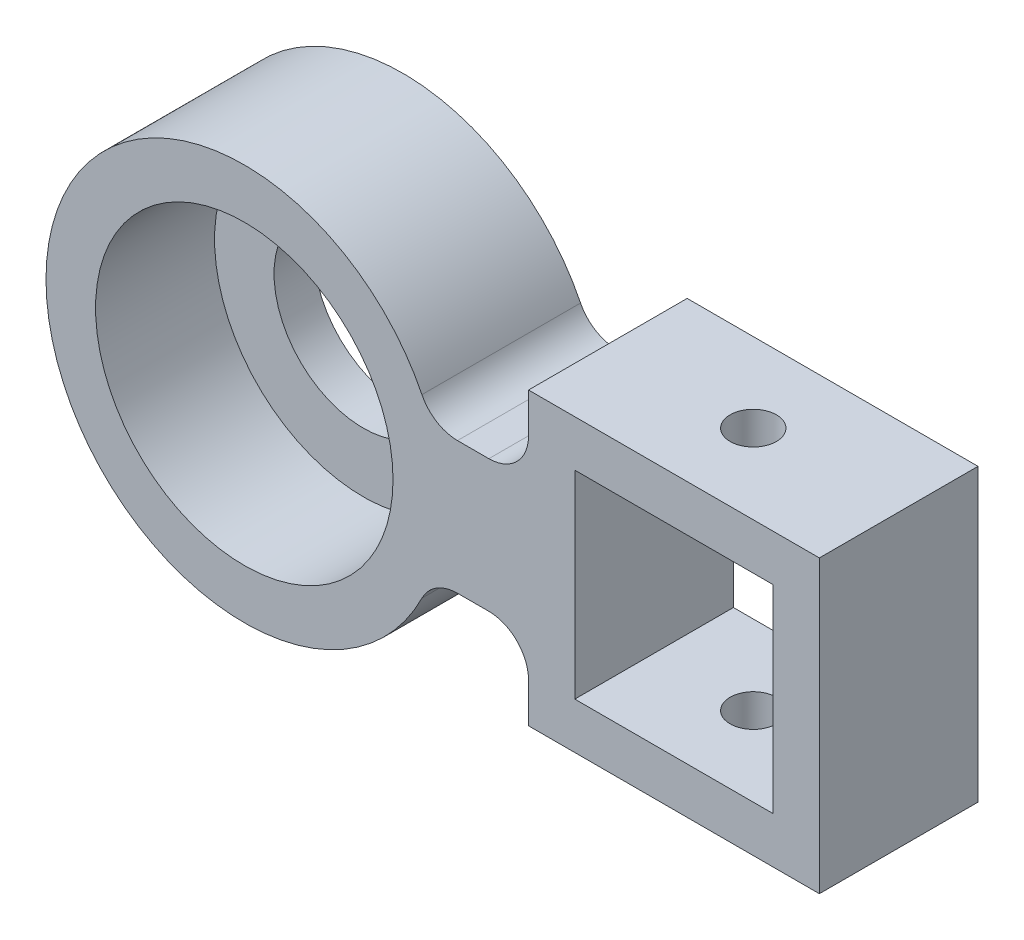
ISO-10303-21;
HEADER;
FILE_DESCRIPTION(('STEP AP214'),'2;1');
FILE_NAME('part.step','',(''),(''),'','','');
FILE_SCHEMA(('AUTOMOTIVE_DESIGN { 1 0 10303 214 1 1 1 1 }'));
ENDSEC;
DATA;
#1=APPLICATION_CONTEXT('core data for automotive mechanical design processes');
#2=APPLICATION_PROTOCOL_DEFINITION('international standard','automotive_design',2000,#1);
#3=PRODUCT_CONTEXT('',#1,'mechanical');
#4=PRODUCT('Part','Part','',(#3));
#5=PRODUCT_RELATED_PRODUCT_CATEGORY('part','',(#4));
#6=PRODUCT_DEFINITION_FORMATION('','',#4);
#7=PRODUCT_DEFINITION_CONTEXT('part definition',#1,'design');
#8=PRODUCT_DEFINITION('design','',#6,#7);
#9=PRODUCT_DEFINITION_SHAPE('','',#8);
#10=(LENGTH_UNIT() NAMED_UNIT(*) SI_UNIT(.MILLI.,.METRE.));
#11=(NAMED_UNIT(*) PLANE_ANGLE_UNIT() SI_UNIT($,.RADIAN.));
#12=(NAMED_UNIT(*) SI_UNIT($,.STERADIAN.) SOLID_ANGLE_UNIT());
#13=UNCERTAINTY_MEASURE_WITH_UNIT(LENGTH_MEASURE(1.E-05),#10,'distance_accuracy_value','');
#14=(GEOMETRIC_REPRESENTATION_CONTEXT(3) GLOBAL_UNCERTAINTY_ASSIGNED_CONTEXT((#13)) GLOBAL_UNIT_ASSIGNED_CONTEXT((#10,
#11,#12)) REPRESENTATION_CONTEXT('',''));
#15=CARTESIAN_POINT('',(0.,0.,0.));
#16=DIRECTION('',(0.,0.,1.));
#17=DIRECTION('',(1.,0.,0.));
#18=AXIS2_PLACEMENT_3D('',#15,#16,#17);
#19=CARTESIAN_POINT('',(-40.368931918618,3.90275593961977,12.));
#20=DIRECTION('',(0.,0.,-1.));
#21=DIRECTION('',(-1.,0.,0.));
#22=AXIS2_PLACEMENT_3D('',#19,#20,#21);
#23=CYLINDRICAL_SURFACE('',#22,6.75);
#24=CARTESIAN_POINT('',(-40.368931918618,3.90275593961977,0.));
#25=DIRECTION('',(0.,0.,1.));
#26=DIRECTION('',(1.,0.,0.));
#27=AXIS2_PLACEMENT_3D('',#24,#25,#26);
#28=CIRCLE('',#27,6.75);
#29=CARTESIAN_POINT('',(-33.618931918618,3.90275593961977,0.));
#30=VERTEX_POINT('',#29);
#31=EDGE_CURVE('E184',#30,#30,#28,.T.);
#32=ORIENTED_EDGE('',*,*,#31,.F.);
#33=EDGE_LOOP('',(#32));
#34=FACE_BOUND('',#33,.T.);
#35=CARTESIAN_POINT('',(-40.368931918618,3.90275593961977,3.));
#36=DIRECTION('',(0.,0.,1.));
#37=DIRECTION('',(1.,0.,0.));
#38=AXIS2_PLACEMENT_3D('',#35,#36,#37);
#39=CIRCLE('',#38,6.75);
#40=CARTESIAN_POINT('',(-33.618931918618,3.90275593961977,3.));
#41=VERTEX_POINT('',#40);
#42=EDGE_CURVE('E39',#41,#41,#39,.T.);
#43=ORIENTED_EDGE('',*,*,#42,.T.);
#44=EDGE_LOOP('',(#43));
#45=FACE_BOUND('',#44,.T.);
#46=ADVANCED_FACE('F35',(#34,#45),#23,.F.);
#47=CARTESIAN_POINT('',(-40.368931918618,3.90275593961977,12.));
#48=DIRECTION('',(0.,0.,1.));
#49=DIRECTION('',(1.,0.,0.));
#50=AXIS2_PLACEMENT_3D('',#47,#48,#49);
#51=PLANE('',#50);
#52=CARTESIAN_POINT('',(-40.368931918618,3.90275593961977,12.));
#53=DIRECTION('',(0.,0.,1.));
#54=DIRECTION('',(1.,0.,0.));
#55=AXIS2_PLACEMENT_3D('',#52,#53,#54);
#56=CIRCLE('',#55,11.25);
#57=CARTESIAN_POINT('',(-29.118931918618,3.90275593961977,12.));
#58=VERTEX_POINT('',#57);
#59=EDGE_CURVE('E413',#58,#58,#56,.T.);
#60=ORIENTED_EDGE('',*,*,#59,.F.);
#61=EDGE_LOOP('',(#60));
#62=FACE_BOUND('',#61,.T.);
#63=DIRECTION('',(1.,0.,0.));
#64=VECTOR('',#63,1.);
#65=CARTESIAN_POINT('',(-15.368931918618,-3.59724406038023,12.));
#66=LINE('',#65,#64);
#67=CARTESIAN_POINT('',(-15.368931918618,-3.59724406038023,12.));
#68=VERTEX_POINT('',#67);
#69=CARTESIAN_POINT('',(-0.368931918617967,-3.59724406038023,12.));
#70=VERTEX_POINT('',#69);
#71=EDGE_CURVE('E161',#68,#70,#66,.T.);
#72=ORIENTED_EDGE('',*,*,#71,.F.);
#73=DIRECTION('',(0.,-1.,0.));
#74=VECTOR('',#73,1.);
#75=CARTESIAN_POINT('',(-15.368931918618,11.4027559396198,12.));
#76=LINE('',#75,#74);
#77=CARTESIAN_POINT('',(-15.368931918618,11.4027559396198,12.));
#78=VERTEX_POINT('',#77);
#79=EDGE_CURVE('E151',#78,#68,#76,.T.);
#80=ORIENTED_EDGE('',*,*,#79,.F.);
#81=DIRECTION('',(-1.,0.,0.));
#82=VECTOR('',#81,1.);
#83=CARTESIAN_POINT('',(-15.368931918618,11.4027559396198,12.));
#84=LINE('',#83,#82);
#85=CARTESIAN_POINT('',(-0.368931918617969,11.4027559396198,12.));
#86=VERTEX_POINT('',#85);
#87=EDGE_CURVE('E177',#86,#78,#84,.T.);
#88=ORIENTED_EDGE('',*,*,#87,.F.);
#89=DIRECTION('',(0.,1.,0.));
#90=VECTOR('',#89,1.);
#91=CARTESIAN_POINT('',(-0.368931918617969,11.4027559396198,12.));
#92=LINE('',#91,#90);
#93=EDGE_CURVE('E175',#70,#86,#92,.T.);
#94=ORIENTED_EDGE('',*,*,#93,.F.);
#95=EDGE_LOOP('',(#72,#80,#88,#94));
#96=FACE_BOUND('',#95,.T.);
#97=DIRECTION('',(0.,-1.,0.));
#98=VECTOR('',#97,1.);
#99=CARTESIAN_POINT('',(-18.868931918618,14.9027559396198,12.));
#100=LINE('',#99,#98);
#101=CARTESIAN_POINT('',(-18.868931918618,14.9027559396198,12.));
#102=VERTEX_POINT('',#101);
#103=CARTESIAN_POINT('',(-18.868931918618,11.9027559396198,12.));
#104=VERTEX_POINT('',#103);
#105=EDGE_CURVE('E195',#102,#104,#100,.T.);
#106=ORIENTED_EDGE('',*,*,#105,.T.);
#107=CARTESIAN_POINT('',(-21.868931918618,11.9027559396198,12.));
#108=DIRECTION('',(0.,0.,1.));
#109=DIRECTION('',(1.,0.,0.));
#110=AXIS2_PLACEMENT_3D('',#107,#108,#109);
#111=CIRCLE('',#110,3.);
#112=CARTESIAN_POINT('',(-21.868931918618,8.90275593961977,12.));
#113=VERTEX_POINT('',#112);
#114=EDGE_CURVE('E273',#104,#113,#111,.F.);
#115=ORIENTED_EDGE('',*,*,#114,.T.);
#116=DIRECTION('',(-1.,0.,0.));
#117=VECTOR('',#116,1.);
#118=CARTESIAN_POINT('',(-26.226796294887,8.90275593961977,12.));
#119=LINE('',#118,#117);
#120=CARTESIAN_POINT('',(-24.2444164220209,8.90275593961977,12.));
#121=VERTEX_POINT('',#120);
#122=EDGE_CURVE('E198',#113,#121,#119,.T.);
#123=ORIENTED_EDGE('',*,*,#122,.T.);
#124=CARTESIAN_POINT('',(-24.2444164220209,11.9027559396198,12.));
#125=DIRECTION('',(0.,0.,1.));
#126=DIRECTION('',(1.,0.,0.));
#127=AXIS2_PLACEMENT_3D('',#124,#125,#126);
#128=CIRCLE('',#127,3.);
#129=CARTESIAN_POINT('',(-26.9318356714537,10.5694226062864,12.));
#130=VERTEX_POINT('',#129);
#131=EDGE_CURVE('E58',#121,#130,#128,.F.);
#132=ORIENTED_EDGE('',*,*,#131,.T.);
#133=CARTESIAN_POINT('',(-40.368931918618,3.90275593961977,12.));
#134=DIRECTION('',(0.,0.,1.));
#135=DIRECTION('',(1.,0.,0.));
#136=AXIS2_PLACEMENT_3D('',#133,#134,#135);
#137=CIRCLE('',#136,15.);
#138=CARTESIAN_POINT('',(-26.9318356714537,-2.7639107270469,12.));
#139=VERTEX_POINT('',#138);
#140=EDGE_CURVE('E201',#130,#139,#137,.T.);
#141=ORIENTED_EDGE('',*,*,#140,.T.);
#142=CARTESIAN_POINT('',(-24.2444164220209,-4.09724406038023,12.));
#143=DIRECTION('',(0.,0.,1.));
#144=DIRECTION('',(1.,0.,0.));
#145=AXIS2_PLACEMENT_3D('',#142,#143,#144);
#146=CIRCLE('',#145,3.);
#147=CARTESIAN_POINT('',(-24.2444164220209,-1.09724406038023,12.));
#148=VERTEX_POINT('',#147);
#149=EDGE_CURVE('E12',#139,#148,#146,.F.);
#150=ORIENTED_EDGE('',*,*,#149,.T.);
#151=DIRECTION('',(1.,0.,0.));
#152=VECTOR('',#151,1.);
#153=CARTESIAN_POINT('',(-26.226796294887,-1.09724406038023,12.));
#154=LINE('',#153,#152);
#155=CARTESIAN_POINT('',(-21.868931918618,-1.09724406038023,12.));
#156=VERTEX_POINT('',#155);
#157=EDGE_CURVE('E203',#148,#156,#154,.T.);
#158=ORIENTED_EDGE('',*,*,#157,.T.);
#159=CARTESIAN_POINT('',(-21.868931918618,-4.09724406038023,12.));
#160=DIRECTION('',(0.,0.,1.));
#161=DIRECTION('',(1.,0.,0.));
#162=AXIS2_PLACEMENT_3D('',#159,#160,#161);
#163=CIRCLE('',#162,3.);
#164=CARTESIAN_POINT('',(-18.868931918618,-4.09724406038023,12.));
#165=VERTEX_POINT('',#164);
#166=EDGE_CURVE('E269',#156,#165,#163,.F.);
#167=ORIENTED_EDGE('',*,*,#166,.T.);
#168=DIRECTION('',(0.,-1.,0.));
#169=VECTOR('',#168,1.);
#170=CARTESIAN_POINT('',(-18.868931918618,-1.09724406038023,12.));
#171=LINE('',#170,#169);
#172=CARTESIAN_POINT('',(-18.868931918618,-7.09724406038023,12.));
#173=VERTEX_POINT('',#172);
#174=EDGE_CURVE('E206',#165,#173,#171,.T.);
#175=ORIENTED_EDGE('',*,*,#174,.T.);
#176=DIRECTION('',(1.,0.,0.));
#177=VECTOR('',#176,1.);
#178=CARTESIAN_POINT('',(-18.868931918618,-7.09724406038023,12.));
#179=LINE('',#178,#177);
#180=CARTESIAN_POINT('',(3.13106808138203,-7.09724406038023,12.));
#181=VERTEX_POINT('',#180);
#182=EDGE_CURVE('E208',#173,#181,#179,.T.);
#183=ORIENTED_EDGE('',*,*,#182,.T.);
#184=DIRECTION('',(0.,1.,0.));
#185=VECTOR('',#184,1.);
#186=CARTESIAN_POINT('',(3.13106808138203,14.9027559396198,12.));
#187=LINE('',#186,#185);
#188=CARTESIAN_POINT('',(3.13106808138203,14.9027559396198,12.));
#189=VERTEX_POINT('',#188);
#190=EDGE_CURVE('E210',#181,#189,#187,.T.);
#191=ORIENTED_EDGE('',*,*,#190,.T.);
#192=DIRECTION('',(-1.,0.,0.));
#193=VECTOR('',#192,1.);
#194=CARTESIAN_POINT('',(-18.868931918618,14.9027559396198,12.));
#195=LINE('',#194,#193);
#196=EDGE_CURVE('E212',#189,#102,#195,.T.);
#197=ORIENTED_EDGE('',*,*,#196,.T.);
#198=EDGE_LOOP('',(#106,#115,#123,#132,#141,#150,#158,#167,#175,#183,#191,#197));
#199=FACE_BOUND('',#198,.T.);
#200=ADVANCED_FACE('F173',(#62,#96,#199),#51,.T.);
#201=CARTESIAN_POINT('',(-40.368931918618,3.90275593961977,0.));
#202=DIRECTION('',(0.,0.,1.));
#203=DIRECTION('',(1.,0.,0.));
#204=AXIS2_PLACEMENT_3D('',#201,#202,#203);
#205=PLANE('',#204);
#206=DIRECTION('',(0.,-1.,0.));
#207=VECTOR('',#206,1.);
#208=CARTESIAN_POINT('',(-15.368931918618,11.4027559396198,0.));
#209=LINE('',#208,#207);
#210=CARTESIAN_POINT('',(-15.368931918618,11.4027559396198,0.));
#211=VERTEX_POINT('',#210);
#212=CARTESIAN_POINT('',(-15.368931918618,-3.59724406038023,0.));
#213=VERTEX_POINT('',#212);
#214=EDGE_CURVE('E182',#211,#213,#209,.T.);
#215=ORIENTED_EDGE('',*,*,#214,.T.);
#216=DIRECTION('',(1.,0.,0.));
#217=VECTOR('',#216,1.);
#218=CARTESIAN_POINT('',(-15.368931918618,-3.59724406038023,0.));
#219=LINE('',#218,#217);
#220=CARTESIAN_POINT('',(-0.368931918617967,-3.59724406038023,0.));
#221=VERTEX_POINT('',#220);
#222=EDGE_CURVE('E168',#213,#221,#219,.T.);
#223=ORIENTED_EDGE('',*,*,#222,.T.);
#224=DIRECTION('',(0.,1.,0.));
#225=VECTOR('',#224,1.);
#226=CARTESIAN_POINT('',(-0.368931918617969,11.4027559396198,0.));
#227=LINE('',#226,#225);
#228=CARTESIAN_POINT('',(-0.368931918617969,11.4027559396198,0.));
#229=VERTEX_POINT('',#228);
#230=EDGE_CURVE('E186',#221,#229,#227,.T.);
#231=ORIENTED_EDGE('',*,*,#230,.T.);
#232=DIRECTION('',(-1.,0.,0.));
#233=VECTOR('',#232,1.);
#234=CARTESIAN_POINT('',(-15.368931918618,11.4027559396198,0.));
#235=LINE('',#234,#233);
#236=EDGE_CURVE('E162',#229,#211,#235,.T.);
#237=ORIENTED_EDGE('',*,*,#236,.T.);
#238=EDGE_LOOP('',(#215,#223,#231,#237));
#239=FACE_BOUND('',#238,.T.);
#240=DIRECTION('',(0.,-1.,0.));
#241=VECTOR('',#240,1.);
#242=CARTESIAN_POINT('',(-18.868931918618,14.9027559396198,0.));
#243=LINE('',#242,#241);
#244=CARTESIAN_POINT('',(-18.868931918618,14.9027559396198,0.));
#245=VERTEX_POINT('',#244);
#246=CARTESIAN_POINT('',(-18.868931918618,11.9027559396198,0.));
#247=VERTEX_POINT('',#246);
#248=EDGE_CURVE('E169',#245,#247,#243,.T.);
#249=ORIENTED_EDGE('',*,*,#248,.F.);
#250=DIRECTION('',(-1.,0.,0.));
#251=VECTOR('',#250,1.);
#252=CARTESIAN_POINT('',(-18.868931918618,14.9027559396198,0.));
#253=LINE('',#252,#251);
#254=CARTESIAN_POINT('',(3.13106808138203,14.9027559396198,0.));
#255=VERTEX_POINT('',#254);
#256=EDGE_CURVE('E199',#255,#245,#253,.T.);
#257=ORIENTED_EDGE('',*,*,#256,.F.);
#258=DIRECTION('',(0.,1.,0.));
#259=VECTOR('',#258,1.);
#260=CARTESIAN_POINT('',(3.13106808138203,14.9027559396198,0.));
#261=LINE('',#260,#259);
#262=CARTESIAN_POINT('',(3.13106808138203,-7.09724406038023,0.));
#263=VERTEX_POINT('',#262);
#264=EDGE_CURVE('E229',#263,#255,#261,.T.);
#265=ORIENTED_EDGE('',*,*,#264,.F.);
#266=DIRECTION('',(1.,0.,0.));
#267=VECTOR('',#266,1.);
#268=CARTESIAN_POINT('',(-18.868931918618,-7.09724406038023,0.));
#269=LINE('',#268,#267);
#270=CARTESIAN_POINT('',(-18.868931918618,-7.09724406038023,0.));
#271=VERTEX_POINT('',#270);
#272=EDGE_CURVE('E227',#271,#263,#269,.T.);
#273=ORIENTED_EDGE('',*,*,#272,.F.);
#274=DIRECTION('',(0.,-1.,0.));
#275=VECTOR('',#274,1.);
#276=CARTESIAN_POINT('',(-18.868931918618,-1.09724406038023,0.));
#277=LINE('',#276,#275);
#278=CARTESIAN_POINT('',(-18.868931918618,-4.09724406038023,0.));
#279=VERTEX_POINT('',#278);
#280=EDGE_CURVE('E225',#279,#271,#277,.T.);
#281=ORIENTED_EDGE('',*,*,#280,.F.);
#282=CARTESIAN_POINT('',(-21.868931918618,-4.09724406038023,0.));
#283=DIRECTION('',(0.,0.,1.));
#284=DIRECTION('',(1.,0.,0.));
#285=AXIS2_PLACEMENT_3D('',#282,#283,#284);
#286=CIRCLE('',#285,3.);
#287=CARTESIAN_POINT('',(-21.868931918618,-1.09724406038023,0.));
#288=VERTEX_POINT('',#287);
#289=EDGE_CURVE('E267',#279,#288,#286,.T.);
#290=ORIENTED_EDGE('',*,*,#289,.T.);
#291=DIRECTION('',(1.,0.,0.));
#292=VECTOR('',#291,1.);
#293=CARTESIAN_POINT('',(-26.226796294887,-1.09724406038023,0.));
#294=LINE('',#293,#292);
#295=CARTESIAN_POINT('',(-24.2444164220209,-1.09724406038023,0.));
#296=VERTEX_POINT('',#295);
#297=EDGE_CURVE('E222',#296,#288,#294,.T.);
#298=ORIENTED_EDGE('',*,*,#297,.F.);
#299=CARTESIAN_POINT('',(-24.2444164220209,-4.09724406038023,0.));
#300=DIRECTION('',(0.,0.,1.));
#301=DIRECTION('',(1.,0.,0.));
#302=AXIS2_PLACEMENT_3D('',#299,#300,#301);
#303=CIRCLE('',#302,3.);
#304=CARTESIAN_POINT('',(-26.9318356714537,-2.7639107270469,0.));
#305=VERTEX_POINT('',#304);
#306=EDGE_CURVE('E44',#296,#305,#303,.T.);
#307=ORIENTED_EDGE('',*,*,#306,.T.);
#308=CARTESIAN_POINT('',(-40.368931918618,3.90275593961977,0.));
#309=DIRECTION('',(0.,0.,1.));
#310=DIRECTION('',(1.,0.,0.));
#311=AXIS2_PLACEMENT_3D('',#308,#309,#310);
#312=CIRCLE('',#311,15.);
#313=CARTESIAN_POINT('',(-26.9318356714537,10.5694226062864,0.));
#314=VERTEX_POINT('',#313);
#315=EDGE_CURVE('E220',#314,#305,#312,.T.);
#316=ORIENTED_EDGE('',*,*,#315,.F.);
#317=CARTESIAN_POINT('',(-24.2444164220209,11.9027559396198,0.));
#318=DIRECTION('',(0.,0.,1.));
#319=DIRECTION('',(1.,0.,0.));
#320=AXIS2_PLACEMENT_3D('',#317,#318,#319);
#321=CIRCLE('',#320,3.);
#322=CARTESIAN_POINT('',(-24.2444164220209,8.90275593961977,0.));
#323=VERTEX_POINT('',#322);
#324=EDGE_CURVE('E275',#314,#323,#321,.T.);
#325=ORIENTED_EDGE('',*,*,#324,.T.);
#326=DIRECTION('',(-1.,0.,0.));
#327=VECTOR('',#326,1.);
#328=CARTESIAN_POINT('',(-26.226796294887,8.90275593961977,0.));
#329=LINE('',#328,#327);
#330=CARTESIAN_POINT('',(-21.868931918618,8.90275593961977,0.));
#331=VERTEX_POINT('',#330);
#332=EDGE_CURVE('E217',#331,#323,#329,.T.);
#333=ORIENTED_EDGE('',*,*,#332,.F.);
#334=CARTESIAN_POINT('',(-21.868931918618,11.9027559396198,0.));
#335=DIRECTION('',(0.,0.,1.));
#336=DIRECTION('',(1.,0.,0.));
#337=AXIS2_PLACEMENT_3D('',#334,#335,#336);
#338=CIRCLE('',#337,3.);
#339=EDGE_CURVE('E271',#331,#247,#338,.T.);
#340=ORIENTED_EDGE('',*,*,#339,.T.);
#341=EDGE_LOOP('',(#249,#257,#265,#273,#281,#290,#298,#307,#316,#325,#333,#340));
#342=FACE_BOUND('',#341,.T.);
#343=ORIENTED_EDGE('',*,*,#31,.T.);
#344=EDGE_LOOP('',(#343));
#345=FACE_BOUND('',#344,.T.);
#346=ADVANCED_FACE('F282',(#239,#342,#345),#205,.F.);
#347=CARTESIAN_POINT('',(-18.868931918618,14.9027559396198,12.));
#348=DIRECTION('',(1.,0.,0.));
#349=DIRECTION('',(0.,1.,0.));
#350=AXIS2_PLACEMENT_3D('',#347,#348,#349);
#351=PLANE('',#350);
#352=ORIENTED_EDGE('',*,*,#248,.T.);
#353=DIRECTION('',(0.,0.,-1.));
#354=VECTOR('',#353,1.);
#355=CARTESIAN_POINT('',(-18.868931918618,11.9027559396198,12.));
#356=LINE('',#355,#354);
#357=EDGE_CURVE('E261',#247,#104,#356,.F.);
#358=ORIENTED_EDGE('',*,*,#357,.T.);
#359=ORIENTED_EDGE('',*,*,#105,.F.);
#360=DIRECTION('',(0.,0.,-1.));
#361=VECTOR('',#360,1.);
#362=CARTESIAN_POINT('',(-18.868931918618,14.9027559396198,12.));
#363=LINE('',#362,#361);
#364=EDGE_CURVE('E214',#102,#245,#363,.T.);
#365=ORIENTED_EDGE('',*,*,#364,.T.);
#366=EDGE_LOOP('',(#352,#358,#359,#365));
#367=FACE_BOUND('',#366,.T.);
#368=ADVANCED_FACE('F319',(#367),#351,.F.);
#369=CARTESIAN_POINT('',(-26.226796294887,8.90275593961977,12.));
#370=DIRECTION('',(0.,-1.,0.));
#371=DIRECTION('',(1.,0.,0.));
#372=AXIS2_PLACEMENT_3D('',#369,#370,#371);
#373=PLANE('',#372);
#374=ORIENTED_EDGE('',*,*,#122,.F.);
#375=DIRECTION('',(0.,0.,-1.));
#376=VECTOR('',#375,1.);
#377=CARTESIAN_POINT('',(-21.868931918618,8.90275593961977,0.));
#378=LINE('',#377,#376);
#379=EDGE_CURVE('E258',#113,#331,#378,.T.);
#380=ORIENTED_EDGE('',*,*,#379,.T.);
#381=ORIENTED_EDGE('',*,*,#332,.T.);
#382=DIRECTION('',(0.,0.,1.));
#383=VECTOR('',#382,1.);
#384=CARTESIAN_POINT('',(-24.2444164220209,8.90275593961977,12.));
#385=LINE('',#384,#383);
#386=EDGE_CURVE('E256',#323,#121,#385,.T.);
#387=ORIENTED_EDGE('',*,*,#386,.T.);
#388=EDGE_LOOP('',(#374,#380,#381,#387));
#389=FACE_BOUND('',#388,.T.);
#390=ADVANCED_FACE('F328',(#389),#373,.F.);
#391=CARTESIAN_POINT('',(-40.368931918618,3.90275593961977,12.));
#392=DIRECTION('',(0.,0.,-1.));
#393=DIRECTION('',(-1.,0.,0.));
#394=AXIS2_PLACEMENT_3D('',#391,#392,#393);
#395=CYLINDRICAL_SURFACE('',#394,15.);
#396=ORIENTED_EDGE('',*,*,#140,.F.);
#397=DIRECTION('',(0.,0.,-1.));
#398=VECTOR('',#397,1.);
#399=CARTESIAN_POINT('',(-26.9318356714537,10.5694226062864,12.));
#400=LINE('',#399,#398);
#401=EDGE_CURVE('E264',#130,#314,#400,.T.);
#402=ORIENTED_EDGE('',*,*,#401,.T.);
#403=ORIENTED_EDGE('',*,*,#315,.T.);
#404=DIRECTION('',(0.,0.,-1.));
#405=VECTOR('',#404,1.);
#406=CARTESIAN_POINT('',(-26.9318356714537,-2.7639107270469,12.));
#407=LINE('',#406,#405);
#408=EDGE_CURVE('E51',#305,#139,#407,.F.);
#409=ORIENTED_EDGE('',*,*,#408,.T.);
#410=EDGE_LOOP('',(#396,#402,#403,#409));
#411=FACE_BOUND('',#410,.T.);
#412=ADVANCED_FACE('F286',(#411),#395,.T.);
#413=CARTESIAN_POINT('',(-26.226796294887,-1.09724406038023,12.));
#414=DIRECTION('',(0.,1.,0.));
#415=DIRECTION('',(-1.,0.,0.));
#416=AXIS2_PLACEMENT_3D('',#413,#414,#415);
#417=PLANE('',#416);
#418=ORIENTED_EDGE('',*,*,#297,.T.);
#419=DIRECTION('',(0.,0.,-1.));
#420=VECTOR('',#419,1.);
#421=CARTESIAN_POINT('',(-21.868931918618,-1.09724406038023,12.));
#422=LINE('',#421,#420);
#423=EDGE_CURVE('E254',#288,#156,#422,.F.);
#424=ORIENTED_EDGE('',*,*,#423,.T.);
#425=ORIENTED_EDGE('',*,*,#157,.F.);
#426=DIRECTION('',(0.,0.,1.));
#427=VECTOR('',#426,1.);
#428=CARTESIAN_POINT('',(-24.2444164220209,-1.09724406038023,0.));
#429=LINE('',#428,#427);
#430=EDGE_CURVE('E251',#148,#296,#429,.F.);
#431=ORIENTED_EDGE('',*,*,#430,.T.);
#432=EDGE_LOOP('',(#418,#424,#425,#431));
#433=FACE_BOUND('',#432,.T.);
#434=ADVANCED_FACE('F292',(#433),#417,.F.);
#435=CARTESIAN_POINT('',(-18.868931918618,-1.09724406038023,12.));
#436=DIRECTION('',(1.,0.,0.));
#437=DIRECTION('',(0.,1.,0.));
#438=AXIS2_PLACEMENT_3D('',#435,#436,#437);
#439=PLANE('',#438);
#440=ORIENTED_EDGE('',*,*,#174,.F.);
#441=DIRECTION('',(0.,0.,-1.));
#442=VECTOR('',#441,1.);
#443=CARTESIAN_POINT('',(-18.868931918618,-4.09724406038023,0.));
#444=LINE('',#443,#442);
#445=EDGE_CURVE('E243',#165,#279,#444,.T.);
#446=ORIENTED_EDGE('',*,*,#445,.T.);
#447=ORIENTED_EDGE('',*,*,#280,.T.);
#448=DIRECTION('',(0.,0.,-1.));
#449=VECTOR('',#448,1.);
#450=CARTESIAN_POINT('',(-18.868931918618,-7.09724406038023,12.));
#451=LINE('',#450,#449);
#452=EDGE_CURVE('E240',#173,#271,#451,.T.);
#453=ORIENTED_EDGE('',*,*,#452,.F.);
#454=EDGE_LOOP('',(#440,#446,#447,#453));
#455=FACE_BOUND('',#454,.T.);
#456=ADVANCED_FACE('F300',(#455),#439,.F.);
#457=CARTESIAN_POINT('',(-18.868931918618,-7.09724406038023,12.));
#458=DIRECTION('',(0.,1.,0.));
#459=DIRECTION('',(0.,0.,1.));
#460=AXIS2_PLACEMENT_3D('',#457,#458,#459);
#461=PLANE('',#460);
#462=CARTESIAN_POINT('',(-7.86893191861797,-7.09724406038023,6.));
#463=DIRECTION('',(0.,-1.,0.));
#464=DIRECTION('',(0.,0.,-1.));
#465=AXIS2_PLACEMENT_3D('',#462,#463,#464);
#466=CIRCLE('',#465,1.75);
#467=CARTESIAN_POINT('',(-7.86893191861797,-7.09724406038022,4.25));
#468=VERTEX_POINT('',#467);
#469=EDGE_CURVE('E402',#468,#468,#466,.T.);
#470=ORIENTED_EDGE('',*,*,#469,.F.);
#471=EDGE_LOOP('',(#470));
#472=FACE_BOUND('',#471,.T.);
#473=ORIENTED_EDGE('',*,*,#272,.T.);
#474=DIRECTION('',(0.,0.,-1.));
#475=VECTOR('',#474,1.);
#476=CARTESIAN_POINT('',(3.13106808138203,-7.09724406038023,12.));
#477=LINE('',#476,#475);
#478=EDGE_CURVE('E237',#181,#263,#477,.T.);
#479=ORIENTED_EDGE('',*,*,#478,.F.);
#480=ORIENTED_EDGE('',*,*,#182,.F.);
#481=ORIENTED_EDGE('',*,*,#452,.T.);
#482=EDGE_LOOP('',(#473,#479,#480,#481));
#483=FACE_BOUND('',#482,.T.);
#484=ADVANCED_FACE('F306',(#472,#483),#461,.F.);
#485=CARTESIAN_POINT('',(3.13106808138203,14.9027559396198,12.));
#486=DIRECTION('',(-1.,0.,0.));
#487=DIRECTION('',(0.,-1.,0.));
#488=AXIS2_PLACEMENT_3D('',#485,#486,#487);
#489=PLANE('',#488);
#490=ORIENTED_EDGE('',*,*,#264,.T.);
#491=DIRECTION('',(0.,0.,-1.));
#492=VECTOR('',#491,1.);
#493=CARTESIAN_POINT('',(3.13106808138203,14.9027559396198,12.));
#494=LINE('',#493,#492);
#495=EDGE_CURVE('E234',#189,#255,#494,.T.);
#496=ORIENTED_EDGE('',*,*,#495,.F.);
#497=ORIENTED_EDGE('',*,*,#190,.F.);
#498=ORIENTED_EDGE('',*,*,#478,.T.);
#499=EDGE_LOOP('',(#490,#496,#497,#498));
#500=FACE_BOUND('',#499,.T.);
#501=ADVANCED_FACE('F312',(#500),#489,.F.);
#502=CARTESIAN_POINT('',(-18.868931918618,14.9027559396198,12.));
#503=DIRECTION('',(0.,-1.,0.));
#504=DIRECTION('',(0.,0.,-1.));
#505=AXIS2_PLACEMENT_3D('',#502,#503,#504);
#506=PLANE('',#505);
#507=CARTESIAN_POINT('',(-7.86893191861797,14.9027559396198,6.));
#508=DIRECTION('',(0.,-1.,0.));
#509=DIRECTION('',(0.,0.,-1.));
#510=AXIS2_PLACEMENT_3D('',#507,#508,#509);
#511=CIRCLE('',#510,1.75);
#512=CARTESIAN_POINT('',(-7.86893191861797,14.9027559396198,4.25));
#513=VERTEX_POINT('',#512);
#514=EDGE_CURVE('E248',#513,#513,#511,.F.);
#515=ORIENTED_EDGE('',*,*,#514,.F.);
#516=EDGE_LOOP('',(#515));
#517=FACE_BOUND('',#516,.T.);
#518=ORIENTED_EDGE('',*,*,#256,.T.);
#519=ORIENTED_EDGE('',*,*,#364,.F.);
#520=ORIENTED_EDGE('',*,*,#196,.F.);
#521=ORIENTED_EDGE('',*,*,#495,.T.);
#522=EDGE_LOOP('',(#518,#519,#520,#521));
#523=FACE_BOUND('',#522,.T.);
#524=ADVANCED_FACE('F316',(#517,#523),#506,.F.);
#525=CARTESIAN_POINT('',(-15.368931918618,11.4027559396198,12.));
#526=DIRECTION('',(1.,0.,0.));
#527=DIRECTION('',(0.,1.,0.));
#528=AXIS2_PLACEMENT_3D('',#525,#526,#527);
#529=PLANE('',#528);
#530=ORIENTED_EDGE('',*,*,#214,.F.);
#531=DIRECTION('',(0.,0.,-1.));
#532=VECTOR('',#531,1.);
#533=CARTESIAN_POINT('',(-15.368931918618,11.4027559396198,12.));
#534=LINE('',#533,#532);
#535=EDGE_CURVE('E157',#78,#211,#534,.T.);
#536=ORIENTED_EDGE('',*,*,#535,.F.);
#537=ORIENTED_EDGE('',*,*,#79,.T.);
#538=DIRECTION('',(0.,0.,-1.));
#539=VECTOR('',#538,1.);
#540=CARTESIAN_POINT('',(-15.368931918618,-3.59724406038023,12.));
#541=LINE('',#540,#539);
#542=EDGE_CURVE('E154',#68,#213,#541,.T.);
#543=ORIENTED_EDGE('',*,*,#542,.T.);
#544=EDGE_LOOP('',(#530,#536,#537,#543));
#545=FACE_BOUND('',#544,.T.);
#546=ADVANCED_FACE('F153',(#545),#529,.T.);
#547=CARTESIAN_POINT('',(-15.368931918618,-3.59724406038023,12.));
#548=DIRECTION('',(0.,1.,0.));
#549=DIRECTION('',(0.,0.,1.));
#550=AXIS2_PLACEMENT_3D('',#547,#548,#549);
#551=PLANE('',#550);
#552=CARTESIAN_POINT('',(-7.86893191861797,-3.59724406038023,6.));
#553=DIRECTION('',(0.,1.,0.));
#554=DIRECTION('',(0.,0.,1.));
#555=AXIS2_PLACEMENT_3D('',#552,#553,#554);
#556=CIRCLE('',#555,1.75);
#557=CARTESIAN_POINT('',(-7.86893191861797,-3.59724406038023,4.25));
#558=VERTEX_POINT('',#557);
#559=EDGE_CURVE('E247',#558,#558,#556,.T.);
#560=ORIENTED_EDGE('',*,*,#559,.F.);
#561=EDGE_LOOP('',(#560));
#562=FACE_BOUND('',#561,.T.);
#563=ORIENTED_EDGE('',*,*,#222,.F.);
#564=ORIENTED_EDGE('',*,*,#542,.F.);
#565=ORIENTED_EDGE('',*,*,#71,.T.);
#566=DIRECTION('',(0.,0.,-1.));
#567=VECTOR('',#566,1.);
#568=CARTESIAN_POINT('',(-0.368931918617967,-3.59724406038023,12.));
#569=LINE('',#568,#567);
#570=EDGE_CURVE('E170',#70,#221,#569,.T.);
#571=ORIENTED_EDGE('',*,*,#570,.T.);
#572=EDGE_LOOP('',(#563,#564,#565,#571));
#573=FACE_BOUND('',#572,.T.);
#574=ADVANCED_FACE('F165',(#562,#573),#551,.T.);
#575=CARTESIAN_POINT('',(-0.368931918617969,11.4027559396198,12.));
#576=DIRECTION('',(-1.,0.,0.));
#577=DIRECTION('',(0.,-1.,0.));
#578=AXIS2_PLACEMENT_3D('',#575,#576,#577);
#579=PLANE('',#578);
#580=ORIENTED_EDGE('',*,*,#230,.F.);
#581=ORIENTED_EDGE('',*,*,#570,.F.);
#582=ORIENTED_EDGE('',*,*,#93,.T.);
#583=DIRECTION('',(0.,0.,-1.));
#584=VECTOR('',#583,1.);
#585=CARTESIAN_POINT('',(-0.368931918617969,11.4027559396198,12.));
#586=LINE('',#585,#584);
#587=EDGE_CURVE('E192',#86,#229,#586,.T.);
#588=ORIENTED_EDGE('',*,*,#587,.T.);
#589=EDGE_LOOP('',(#580,#581,#582,#588));
#590=FACE_BOUND('',#589,.T.);
#591=ADVANCED_FACE('F356',(#590),#579,.T.);
#592=CARTESIAN_POINT('',(-15.368931918618,11.4027559396198,12.));
#593=DIRECTION('',(0.,-1.,0.));
#594=DIRECTION('',(0.,0.,-1.));
#595=AXIS2_PLACEMENT_3D('',#592,#593,#594);
#596=PLANE('',#595);
#597=CARTESIAN_POINT('',(-7.86893191861797,11.4027559396198,6.));
#598=DIRECTION('',(0.,-1.,0.));
#599=DIRECTION('',(0.,0.,-1.));
#600=AXIS2_PLACEMENT_3D('',#597,#598,#599);
#601=CIRCLE('',#600,1.75);
#602=CARTESIAN_POINT('',(-7.86893191861797,11.4027559396198,4.25));
#603=VERTEX_POINT('',#602);
#604=EDGE_CURVE('E244',#603,#603,#601,.T.);
#605=ORIENTED_EDGE('',*,*,#604,.F.);
#606=EDGE_LOOP('',(#605));
#607=FACE_BOUND('',#606,.T.);
#608=ORIENTED_EDGE('',*,*,#236,.F.);
#609=ORIENTED_EDGE('',*,*,#587,.F.);
#610=ORIENTED_EDGE('',*,*,#87,.T.);
#611=ORIENTED_EDGE('',*,*,#535,.T.);
#612=EDGE_LOOP('',(#608,#609,#610,#611));
#613=FACE_BOUND('',#612,.T.);
#614=ADVANCED_FACE('F353',(#607,#613),#596,.T.);
#615=CARTESIAN_POINT('',(-7.86893191861797,19.8525034079256,6.));
#616=DIRECTION('',(0.,-1.,0.));
#617=DIRECTION('',(0.,0.,-1.));
#618=AXIS2_PLACEMENT_3D('',#615,#616,#617);
#619=CYLINDRICAL_SURFACE('',#618,1.75);
#620=CARTESIAN_POINT('',(-7.86893191861797,11.4027559396198,4.25));
#621=CARTESIAN_POINT('',(-7.86893191861797,11.4392142729531,4.25));
#622=CARTESIAN_POINT('',(-7.86893191861797,11.4756726062864,4.25));
#623=CARTESIAN_POINT('',(-7.86893191861797,11.5485892729531,4.25));
#624=CARTESIAN_POINT('',(-7.86893191861797,11.5850476062864,4.25));
#625=CARTESIAN_POINT('',(-7.86893191861797,11.6579642729531,4.25));
#626=CARTESIAN_POINT('',(-7.86893191861797,11.6944226062864,4.25));
#627=CARTESIAN_POINT('',(-7.86893191861797,11.7673392729531,4.25));
#628=CARTESIAN_POINT('',(-7.86893191861797,11.8037976062864,4.25));
#629=CARTESIAN_POINT('',(-7.86893191861797,11.8767142729531,4.25));
#630=CARTESIAN_POINT('',(-7.86893191861797,11.9131726062864,4.25));
#631=CARTESIAN_POINT('',(-7.86893191861797,11.9860892729531,4.25));
#632=CARTESIAN_POINT('',(-7.86893191861797,12.0225476062864,4.25));
#633=CARTESIAN_POINT('',(-7.86893191861797,12.0954642729531,4.25));
#634=CARTESIAN_POINT('',(-7.86893191861797,12.1319226062864,4.25));
#635=CARTESIAN_POINT('',(-7.86893191861797,12.2048392729531,4.25));
#636=CARTESIAN_POINT('',(-7.86893191861797,12.2412976062864,4.25));
#637=CARTESIAN_POINT('',(-7.86893191861797,12.3142142729531,4.25));
#638=CARTESIAN_POINT('',(-7.86893191861797,12.3506726062864,4.25));
#639=CARTESIAN_POINT('',(-7.86893191861797,12.4235892729531,4.25));
#640=CARTESIAN_POINT('',(-7.86893191861797,12.4600476062864,4.25));
#641=CARTESIAN_POINT('',(-7.86893191861797,12.5329642729531,4.25));
#642=CARTESIAN_POINT('',(-7.86893191861797,12.5694226062864,4.25));
#643=CARTESIAN_POINT('',(-7.86893191861797,12.6423392729531,4.25));
#644=CARTESIAN_POINT('',(-7.86893191861797,12.6787976062864,4.25));
#645=CARTESIAN_POINT('',(-7.86893191861797,12.7517142729531,4.25));
#646=CARTESIAN_POINT('',(-7.86893191861797,12.7881726062864,4.25));
#647=CARTESIAN_POINT('',(-7.86893191861797,12.8610892729531,4.25));
#648=CARTESIAN_POINT('',(-7.86893191861797,12.8975476062864,4.25));
#649=CARTESIAN_POINT('',(-7.86893191861797,12.9704642729531,4.25));
#650=CARTESIAN_POINT('',(-7.86893191861797,13.0069226062864,4.25));
#651=CARTESIAN_POINT('',(-7.86893191861797,13.0798392729531,4.25));
#652=CARTESIAN_POINT('',(-7.86893191861797,13.1162976062864,4.25));
#653=CARTESIAN_POINT('',(-7.86893191861797,13.1892142729531,4.25));
#654=CARTESIAN_POINT('',(-7.86893191861797,13.2256726062864,4.25));
#655=CARTESIAN_POINT('',(-7.86893191861797,13.2985892729531,4.25));
#656=CARTESIAN_POINT('',(-7.86893191861797,13.3350476062864,4.25));
#657=CARTESIAN_POINT('',(-7.86893191861797,13.4079642729531,4.25));
#658=CARTESIAN_POINT('',(-7.86893191861797,13.4444226062864,4.25));
#659=CARTESIAN_POINT('',(-7.86893191861797,13.5173392729531,4.25));
#660=CARTESIAN_POINT('',(-7.86893191861797,13.5537976062864,4.25));
#661=CARTESIAN_POINT('',(-7.86893191861797,13.6267142729531,4.25));
#662=CARTESIAN_POINT('',(-7.86893191861797,13.6631726062864,4.25));
#663=CARTESIAN_POINT('',(-7.86893191861797,13.7360892729531,4.25));
#664=CARTESIAN_POINT('',(-7.86893191861797,13.7725476062864,4.25));
#665=CARTESIAN_POINT('',(-7.86893191861797,13.8454642729531,4.25));
#666=CARTESIAN_POINT('',(-7.86893191861797,13.8819226062864,4.25));
#667=CARTESIAN_POINT('',(-7.86893191861797,13.9548392729531,4.25));
#668=CARTESIAN_POINT('',(-7.86893191861797,13.9912976062864,4.25));
#669=CARTESIAN_POINT('',(-7.86893191861797,14.0642142729531,4.25));
#670=CARTESIAN_POINT('',(-7.86893191861797,14.1006726062864,4.25));
#671=CARTESIAN_POINT('',(-7.86893191861797,14.1735892729531,4.25));
#672=CARTESIAN_POINT('',(-7.86893191861797,14.2100476062864,4.25));
#673=CARTESIAN_POINT('',(-7.86893191861797,14.2829642729531,4.25));
#674=CARTESIAN_POINT('',(-7.86893191861797,14.3194226062864,4.25));
#675=CARTESIAN_POINT('',(-7.86893191861797,14.3923392729531,4.25));
#676=CARTESIAN_POINT('',(-7.86893191861797,14.4287976062864,4.25));
#677=CARTESIAN_POINT('',(-7.86893191861797,14.5017142729531,4.25));
#678=CARTESIAN_POINT('',(-7.86893191861797,14.5381726062864,4.25));
#679=CARTESIAN_POINT('',(-7.86893191861797,14.6110892729531,4.25));
#680=CARTESIAN_POINT('',(-7.86893191861797,14.6475476062864,4.25));
#681=CARTESIAN_POINT('',(-7.86893191861797,14.7204642729531,4.25));
#682=CARTESIAN_POINT('',(-7.86893191861797,14.7569226062864,4.25));
#683=CARTESIAN_POINT('',(-7.86893191861797,14.8298392729531,4.25));
#684=CARTESIAN_POINT('',(-7.86893191861797,14.8662976062864,4.25));
#685=CARTESIAN_POINT('',(-7.86893191861797,14.9027559396198,4.25));
#686=B_SPLINE_CURVE_WITH_KNOTS('',3,(#620,#621,#622,#623,#624,#625,#626,#627,#628,#629,#630,
#631,#632,#633,#634,#635,#636,#637,#638,#639,#640,#641,#642,#643,#644,#645,#646,#647,#648,#649,
#650,#651,#652,#653,#654,#655,#656,#657,#658,#659,#660,#661,#662,#663,#664,#665,#666,#667,#668,
#669,#670,#671,#672,#673,#674,#675,#676,#677,#678,#679,#680,#681,#682,#683,#684,#685),
.UNSPECIFIED.,.F.,.F.,(4,2,2,2,2,2,2,2,2,2,2,2,2,2,2,2,2,2,2,2,2,2,2,2,2,2,2,2,2,2,2,2,4),(0.,
0.109375,0.21875,0.328125,0.4375,0.546875,0.656249999999999,0.765624999999999,0.874999999999999,
0.984374999999999,1.09375,1.203125,1.3125,1.421875,1.53125,1.640625,1.75,1.859375,1.96875,
2.078125,2.1875,2.296875,2.40625,2.515625,2.625,2.734375,2.84375,2.953125,3.0625,3.171875,
3.28125,3.390625,3.5),.UNSPECIFIED.);
#687=EDGE_CURVE('BSEAM351',#603,#513,#686,.T.);
#688=ORIENTED_EDGE('',*,*,#604,.T.);
#689=ORIENTED_EDGE('',*,*,#514,.T.);
#690=ORIENTED_EDGE('',*,*,#687,.T.);
#691=ORIENTED_EDGE('',*,*,#687,.F.);
#692=EDGE_LOOP('',(#688,#690,#689,#691));
#693=FACE_BOUND('',#692,.T.);
#694=ADVANCED_FACE('F351',(#693),#619,.F.);
#695=CARTESIAN_POINT('',(-7.86893191861797,-3.59724406038023,4.25));
#696=CARTESIAN_POINT('',(-7.86893191861797,-3.63370239371356,4.25));
#697=CARTESIAN_POINT('',(-7.86893191861797,-3.67016072704689,4.25));
#698=CARTESIAN_POINT('',(-7.86893191861797,-3.74307739371356,4.25));
#699=CARTESIAN_POINT('',(-7.86893191861797,-3.77953572704689,4.25));
#700=CARTESIAN_POINT('',(-7.86893191861797,-3.85245239371356,4.25));
#701=CARTESIAN_POINT('',(-7.86893191861797,-3.88891072704689,4.25));
#702=CARTESIAN_POINT('',(-7.86893191861797,-3.96182739371356,4.25));
#703=CARTESIAN_POINT('',(-7.86893191861797,-3.99828572704689,4.25));
#704=CARTESIAN_POINT('',(-7.86893191861797,-4.07120239371356,4.25));
#705=CARTESIAN_POINT('',(-7.86893191861797,-4.10766072704689,4.25));
#706=CARTESIAN_POINT('',(-7.86893191861797,-4.18057739371356,4.25));
#707=CARTESIAN_POINT('',(-7.86893191861797,-4.21703572704689,4.25));
#708=CARTESIAN_POINT('',(-7.86893191861797,-4.28995239371356,4.25));
#709=CARTESIAN_POINT('',(-7.86893191861797,-4.32641072704689,4.25));
#710=CARTESIAN_POINT('',(-7.86893191861797,-4.39932739371356,4.25));
#711=CARTESIAN_POINT('',(-7.86893191861797,-4.43578572704689,4.25));
#712=CARTESIAN_POINT('',(-7.86893191861797,-4.50870239371356,4.25));
#713=CARTESIAN_POINT('',(-7.86893191861797,-4.54516072704689,4.25));
#714=CARTESIAN_POINT('',(-7.86893191861797,-4.61807739371356,4.25));
#715=CARTESIAN_POINT('',(-7.86893191861797,-4.65453572704689,4.25));
#716=CARTESIAN_POINT('',(-7.86893191861797,-4.72745239371356,4.25));
#717=CARTESIAN_POINT('',(-7.86893191861797,-4.76391072704689,4.25));
#718=CARTESIAN_POINT('',(-7.86893191861797,-4.83682739371356,4.25));
#719=CARTESIAN_POINT('',(-7.86893191861797,-4.87328572704689,4.25));
#720=CARTESIAN_POINT('',(-7.86893191861797,-4.94620239371356,4.25));
#721=CARTESIAN_POINT('',(-7.86893191861797,-4.98266072704689,4.25));
#722=CARTESIAN_POINT('',(-7.86893191861797,-5.05557739371356,4.25));
#723=CARTESIAN_POINT('',(-7.86893191861797,-5.09203572704689,4.25));
#724=CARTESIAN_POINT('',(-7.86893191861797,-5.16495239371356,4.25));
#725=CARTESIAN_POINT('',(-7.86893191861797,-5.20141072704689,4.25));
#726=CARTESIAN_POINT('',(-7.86893191861797,-5.27432739371356,4.25));
#727=CARTESIAN_POINT('',(-7.86893191861797,-5.31078572704689,4.25));
#728=CARTESIAN_POINT('',(-7.86893191861797,-5.38370239371356,4.25));
#729=CARTESIAN_POINT('',(-7.86893191861797,-5.42016072704689,4.25));
#730=CARTESIAN_POINT('',(-7.86893191861797,-5.49307739371356,4.25));
#731=CARTESIAN_POINT('',(-7.86893191861797,-5.52953572704689,4.25));
#732=CARTESIAN_POINT('',(-7.86893191861797,-5.60245239371356,4.25));
#733=CARTESIAN_POINT('',(-7.86893191861797,-5.63891072704689,4.25));
#734=CARTESIAN_POINT('',(-7.86893191861797,-5.71182739371356,4.25));
#735=CARTESIAN_POINT('',(-7.86893191861797,-5.74828572704689,4.25));
#736=CARTESIAN_POINT('',(-7.86893191861797,-5.82120239371356,4.25));
#737=CARTESIAN_POINT('',(-7.86893191861797,-5.85766072704689,4.25));
#738=CARTESIAN_POINT('',(-7.86893191861797,-5.93057739371356,4.25));
#739=CARTESIAN_POINT('',(-7.86893191861797,-5.96703572704689,4.25));
#740=CARTESIAN_POINT('',(-7.86893191861797,-6.03995239371356,4.25));
#741=CARTESIAN_POINT('',(-7.86893191861797,-6.07641072704689,4.25));
#742=CARTESIAN_POINT('',(-7.86893191861797,-6.14932739371356,4.25));
#743=CARTESIAN_POINT('',(-7.86893191861797,-6.18578572704689,4.25));
#744=CARTESIAN_POINT('',(-7.86893191861797,-6.25870239371356,4.25));
#745=CARTESIAN_POINT('',(-7.86893191861797,-6.29516072704689,4.25));
#746=CARTESIAN_POINT('',(-7.86893191861797,-6.36807739371356,4.25));
#747=CARTESIAN_POINT('',(-7.86893191861797,-6.40453572704689,4.25));
#748=CARTESIAN_POINT('',(-7.86893191861797,-6.47745239371356,4.25));
#749=CARTESIAN_POINT('',(-7.86893191861797,-6.51391072704689,4.25));
#750=CARTESIAN_POINT('',(-7.86893191861797,-6.58682739371356,4.25));
#751=CARTESIAN_POINT('',(-7.86893191861797,-6.62328572704689,4.25));
#752=CARTESIAN_POINT('',(-7.86893191861797,-6.69620239371356,4.25));
#753=CARTESIAN_POINT('',(-7.86893191861797,-6.73266072704689,4.25));
#754=CARTESIAN_POINT('',(-7.86893191861797,-6.80557739371356,4.25));
#755=CARTESIAN_POINT('',(-7.86893191861797,-6.84203572704689,4.25));
#756=CARTESIAN_POINT('',(-7.86893191861797,-6.91495239371356,4.25));
#757=CARTESIAN_POINT('',(-7.86893191861797,-6.95141072704689,4.25));
#758=CARTESIAN_POINT('',(-7.86893191861797,-7.02432739371356,4.25));
#759=CARTESIAN_POINT('',(-7.86893191861797,-7.06078572704689,4.25));
#760=CARTESIAN_POINT('',(-7.86893191861797,-7.09724406038022,4.25));
#761=B_SPLINE_CURVE_WITH_KNOTS('',3,(#695,#696,#697,#698,#699,#700,#701,#702,#703,#704,#705,
#706,#707,#708,#709,#710,#711,#712,#713,#714,#715,#716,#717,#718,#719,#720,#721,#722,#723,#724,
#725,#726,#727,#728,#729,#730,#731,#732,#733,#734,#735,#736,#737,#738,#739,#740,#741,#742,#743,
#744,#745,#746,#747,#748,#749,#750,#751,#752,#753,#754,#755,#756,#757,#758,#759,#760),
.UNSPECIFIED.,.F.,.F.,(4,2,2,2,2,2,2,2,2,2,2,2,2,2,2,2,2,2,2,2,2,2,2,2,2,2,2,2,2,2,2,2,4),(0.,
0.109374999999998,0.21875,0.328124999999999,0.4375,0.546874999999999,0.656250000000001,
0.765624999999999,0.875000000000001,0.984374999999999,1.09375,1.203125,1.3125,1.421875,1.53125,
1.640625,1.75,1.859375,1.96875,2.078125,2.1875,2.296875,2.40625,2.515625,2.625,2.734375,2.84375,
2.953125,3.0625,3.171875,3.28125,3.39062499999999,3.5),.UNSPECIFIED.);
#762=EDGE_CURVE('BSEAM388',#558,#468,#761,.T.);
#763=ORIENTED_EDGE('',*,*,#559,.T.);
#764=ORIENTED_EDGE('',*,*,#469,.T.);
#765=ORIENTED_EDGE('',*,*,#762,.T.);
#766=ORIENTED_EDGE('',*,*,#762,.F.);
#767=EDGE_LOOP('',(#763,#765,#764,#766));
#768=FACE_BOUND('',#767,.T.);
#769=ADVANCED_FACE('F388',(#768),#619,.F.);
#770=CARTESIAN_POINT('',(-21.868931918618,-4.09724406038023,12.));
#771=DIRECTION('',(0.,0.,1.));
#772=DIRECTION('',(1.,0.,0.));
#773=AXIS2_PLACEMENT_3D('',#770,#771,#772);
#774=CYLINDRICAL_SURFACE('',#773,3.);
#775=ORIENTED_EDGE('',*,*,#166,.F.);
#776=ORIENTED_EDGE('',*,*,#423,.F.);
#777=ORIENTED_EDGE('',*,*,#289,.F.);
#778=ORIENTED_EDGE('',*,*,#445,.F.);
#779=EDGE_LOOP('',(#775,#776,#777,#778));
#780=FACE_BOUND('',#779,.T.);
#781=ADVANCED_FACE('F295',(#780),#774,.F.);
#782=CARTESIAN_POINT('',(-21.868931918618,11.9027559396198,12.));
#783=DIRECTION('',(0.,0.,1.));
#784=DIRECTION('',(1.,0.,0.));
#785=AXIS2_PLACEMENT_3D('',#782,#783,#784);
#786=CYLINDRICAL_SURFACE('',#785,3.);
#787=ORIENTED_EDGE('',*,*,#114,.F.);
#788=ORIENTED_EDGE('',*,*,#357,.F.);
#789=ORIENTED_EDGE('',*,*,#339,.F.);
#790=ORIENTED_EDGE('',*,*,#379,.F.);
#791=EDGE_LOOP('',(#787,#788,#789,#790));
#792=FACE_BOUND('',#791,.T.);
#793=ADVANCED_FACE('F325',(#792),#786,.F.);
#794=CARTESIAN_POINT('',(-24.2444164220209,11.9027559396198,12.));
#795=DIRECTION('',(0.,0.,-1.));
#796=DIRECTION('',(-1.,0.,0.));
#797=AXIS2_PLACEMENT_3D('',#794,#795,#796);
#798=CYLINDRICAL_SURFACE('',#797,3.);
#799=ORIENTED_EDGE('',*,*,#131,.F.);
#800=ORIENTED_EDGE('',*,*,#386,.F.);
#801=ORIENTED_EDGE('',*,*,#324,.F.);
#802=ORIENTED_EDGE('',*,*,#401,.F.);
#803=EDGE_LOOP('',(#799,#800,#801,#802));
#804=FACE_BOUND('',#803,.T.);
#805=ADVANCED_FACE('F331',(#804),#798,.F.);
#806=CARTESIAN_POINT('',(-24.2444164220209,-4.09724406038023,12.));
#807=DIRECTION('',(0.,0.,-1.));
#808=DIRECTION('',(-1.,0.,0.));
#809=AXIS2_PLACEMENT_3D('',#806,#807,#808);
#810=CYLINDRICAL_SURFACE('',#809,3.);
#811=ORIENTED_EDGE('',*,*,#149,.F.);
#812=ORIENTED_EDGE('',*,*,#408,.F.);
#813=ORIENTED_EDGE('',*,*,#306,.F.);
#814=ORIENTED_EDGE('',*,*,#430,.F.);
#815=EDGE_LOOP('',(#811,#812,#813,#814));
#816=FACE_BOUND('',#815,.T.);
#817=ADVANCED_FACE('F37',(#816),#810,.F.);
#818=CARTESIAN_POINT('',(-40.368931918618,3.90275593961977,-31.8198051533946));
#819=DIRECTION('',(0.,0.,1.));
#820=DIRECTION('',(1.,0.,0.));
#821=AXIS2_PLACEMENT_3D('',#818,#819,#820);
#822=CYLINDRICAL_SURFACE('',#821,11.25);
#823=CARTESIAN_POINT('',(-40.368931918618,3.90275593961977,3.));
#824=DIRECTION('',(0.,0.,1.));
#825=DIRECTION('',(1.,0.,0.));
#826=AXIS2_PLACEMENT_3D('',#823,#824,#825);
#827=CIRCLE('',#826,11.25);
#828=CARTESIAN_POINT('',(-29.118931918618,3.90275593961977,3.));
#829=VERTEX_POINT('',#828);
#830=EDGE_CURVE('E407',#829,#829,#827,.F.);
#831=ORIENTED_EDGE('',*,*,#830,.T.);
#832=EDGE_LOOP('',(#831));
#833=FACE_BOUND('',#832,.T.);
#834=ORIENTED_EDGE('',*,*,#59,.T.);
#835=EDGE_LOOP('',(#834));
#836=FACE_BOUND('',#835,.T.);
#837=ADVANCED_FACE('F337',(#833,#836),#822,.F.);
#838=CARTESIAN_POINT('',(-40.368931918618,3.90275593961977,3.));
#839=DIRECTION('',(0.,0.,1.));
#840=DIRECTION('',(1.,0.,0.));
#841=AXIS2_PLACEMENT_3D('',#838,#839,#840);
#842=PLANE('',#841);
#843=ORIENTED_EDGE('',*,*,#42,.F.);
#844=EDGE_LOOP('',(#843));
#845=FACE_BOUND('',#844,.T.);
#846=ORIENTED_EDGE('',*,*,#830,.F.);
#847=EDGE_LOOP('',(#846));
#848=FACE_BOUND('',#847,.T.);
#849=ADVANCED_FACE('F418',(#845,#848),#842,.T.);
#850=CLOSED_SHELL('',(#46,#200,#346,#368,#390,#412,#434,#456,#484,#501,#524,#546,#574,#591,#614,
#694,#769,#781,#793,#805,#817,#837,#849));
#851=MANIFOLD_SOLID_BREP('B2',#850);
#852=ADVANCED_BREP_SHAPE_REPRESENTATION('',(#18,#851),#14);
#853=SHAPE_DEFINITION_REPRESENTATION(#9,#852);
ENDSEC;
END-ISO-10303-21;
